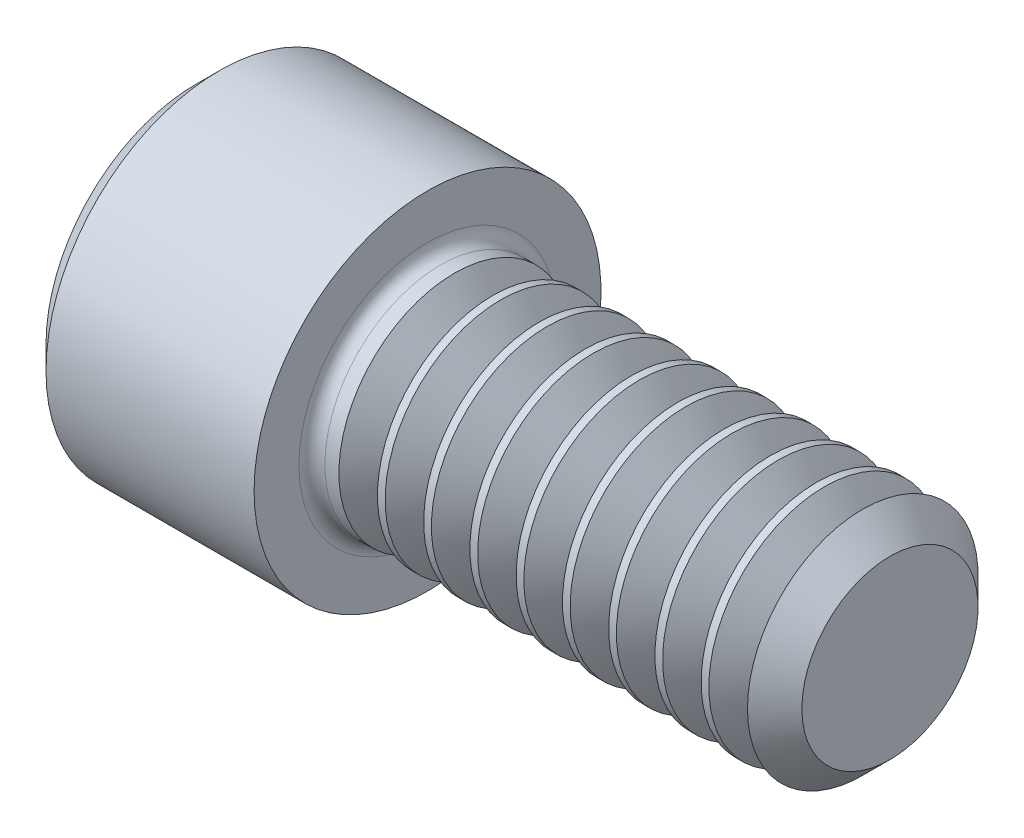
ISO-10303-21;
HEADER;
FILE_DESCRIPTION(('STEP AP214'),'2;1');
FILE_NAME('part.step','',(''),(''),'','','');
FILE_SCHEMA(('AUTOMOTIVE_DESIGN { 1 0 10303 214 1 1 1 1 }'));
ENDSEC;
DATA;
#1=APPLICATION_CONTEXT('core data for automotive mechanical design processes');
#2=APPLICATION_PROTOCOL_DEFINITION('international standard','automotive_design',2000,#1);
#3=PRODUCT_CONTEXT('',#1,'mechanical');
#4=PRODUCT('Part','Part','',(#3));
#5=PRODUCT_RELATED_PRODUCT_CATEGORY('part','',(#4));
#6=PRODUCT_DEFINITION_FORMATION('','',#4);
#7=PRODUCT_DEFINITION_CONTEXT('part definition',#1,'design');
#8=PRODUCT_DEFINITION('design','',#6,#7);
#9=PRODUCT_DEFINITION_SHAPE('','',#8);
#10=(LENGTH_UNIT() NAMED_UNIT(*) SI_UNIT(.MILLI.,.METRE.));
#11=(NAMED_UNIT(*) PLANE_ANGLE_UNIT() SI_UNIT($,.RADIAN.));
#12=(NAMED_UNIT(*) SI_UNIT($,.STERADIAN.) SOLID_ANGLE_UNIT());
#13=UNCERTAINTY_MEASURE_WITH_UNIT(LENGTH_MEASURE(1.E-05),#10,'distance_accuracy_value','');
#14=(GEOMETRIC_REPRESENTATION_CONTEXT(3) GLOBAL_UNCERTAINTY_ASSIGNED_CONTEXT((#13)) GLOBAL_UNIT_ASSIGNED_CONTEXT((#10,
#11,#12)) REPRESENTATION_CONTEXT('',''));
#15=CARTESIAN_POINT('',(0.,0.,0.));
#16=DIRECTION('',(0.,0.,1.));
#17=DIRECTION('',(1.,0.,0.));
#18=AXIS2_PLACEMENT_3D('',#15,#16,#17);
#19=CARTESIAN_POINT('',(0.,0.,0.));
#20=DIRECTION('',(-1.,0.,0.));
#21=DIRECTION('',(0.,0.,1.));
#22=AXIS2_PLACEMENT_3D('',#19,#20,#21);
#23=PLANE('',#22);
#24=DIRECTION('',(0.,-0.499999999999998,0.86602540378444));
#25=VECTOR('',#24,1.);
#26=CARTESIAN_POINT('',(0.,2.7496306570156,0.));
#27=LINE('',#26,#25);
#28=CARTESIAN_POINT('',(0.,2.7496306570156,0.));
#29=VERTEX_POINT('',#28);
#30=CARTESIAN_POINT('',(0.,1.37481532850781,2.38125));
#31=VERTEX_POINT('',#30);
#32=EDGE_CURVE('E685',#29,#31,#27,.T.);
#33=ORIENTED_EDGE('',*,*,#32,.T.);
#34=DIRECTION('',(0.,1.,0.));
#35=VECTOR('',#34,1.);
#36=CARTESIAN_POINT('',(0.,-1.37481532850779,2.38125));
#37=LINE('',#36,#35);
#38=CARTESIAN_POINT('',(0.,-1.37481532850779,2.38125));
#39=VERTEX_POINT('',#38);
#40=EDGE_CURVE('E130',#39,#31,#37,.T.);
#41=ORIENTED_EDGE('',*,*,#40,.F.);
#42=DIRECTION('',(0.,-0.500000000000001,-0.866025403784438));
#43=VECTOR('',#42,1.);
#44=CARTESIAN_POINT('',(0.,-1.37481532850779,2.38125));
#45=LINE('',#44,#43);
#46=CARTESIAN_POINT('',(0.,-2.74963065701559,0.));
#47=VERTEX_POINT('',#46);
#48=EDGE_CURVE('E704',#39,#47,#45,.T.);
#49=ORIENTED_EDGE('',*,*,#48,.T.);
#50=DIRECTION('',(0.,0.499999999999998,-0.86602540378444));
#51=VECTOR('',#50,1.);
#52=CARTESIAN_POINT('',(0.,-2.74963065701559,0.));
#53=LINE('',#52,#51);
#54=CARTESIAN_POINT('',(0.,-1.37481532850779,-2.38125));
#55=VERTEX_POINT('',#54);
#56=EDGE_CURVE('E707',#47,#55,#53,.T.);
#57=ORIENTED_EDGE('',*,*,#56,.T.);
#58=DIRECTION('',(0.,-1.,0.));
#59=VECTOR('',#58,1.);
#60=CARTESIAN_POINT('',(0.,1.3748153285078,-2.38125));
#61=LINE('',#60,#59);
#62=CARTESIAN_POINT('',(0.,1.3748153285078,-2.38125));
#63=VERTEX_POINT('',#62);
#64=EDGE_CURVE('E710',#63,#55,#61,.T.);
#65=ORIENTED_EDGE('',*,*,#64,.F.);
#66=DIRECTION('',(0.,-0.500000000000001,-0.866025403784438));
#67=VECTOR('',#66,1.);
#68=CARTESIAN_POINT('',(0.,2.7496306570156,0.));
#69=LINE('',#68,#67);
#70=EDGE_CURVE('E125',#29,#63,#69,.T.);
#71=ORIENTED_EDGE('',*,*,#70,.F.);
#72=EDGE_LOOP('',(#33,#41,#49,#57,#65,#71));
#73=FACE_BOUND('',#72,.T.);
#74=CARTESIAN_POINT('',(0.,0.,0.));
#75=DIRECTION('',(-1.,0.,0.));
#76=DIRECTION('',(0.,0.,1.));
#77=AXIS2_PLACEMENT_3D('',#74,#75,#76);
#78=CIRCLE('',#77,4.1275);
#79=CARTESIAN_POINT('',(0.,0.,4.1275));
#80=VERTEX_POINT('',#79);
#81=EDGE_CURVE('E141',#80,#80,#78,.T.);
#82=ORIENTED_EDGE('',*,*,#81,.T.);
#83=EDGE_LOOP('',(#82));
#84=FACE_BOUND('',#83,.T.);
#85=ADVANCED_FACE('F33',(#73,#84),#23,.T.);
#86=CARTESIAN_POINT('',(-31.75,0.,0.));
#87=DIRECTION('',(-1.,0.,0.));
#88=DIRECTION('',(0.,0.,1.));
#89=AXIS2_PLACEMENT_3D('',#86,#87,#88);
#90=CYLINDRICAL_SURFACE('',#89,3.17499999999998);
#91=CARTESIAN_POINT('',(7.09088817375183,0.,0.));
#92=DIRECTION('',(-1.,0.,0.));
#93=DIRECTION('',(0.,-1.,0.));
#94=AXIS2_PLACEMENT_3D('',#91,#92,#93);
#95=CIRCLE('',#94,3.175);
#96=CARTESIAN_POINT('',(7.09088817375183,-3.175,0.));
#97=VERTEX_POINT('',#96);
#98=EDGE_CURVE('E680',#97,#97,#95,.T.);
#99=ORIENTED_EDGE('',*,*,#98,.T.);
#100=EDGE_LOOP('',(#99));
#101=FACE_BOUND('',#100,.T.);
#102=CARTESIAN_POINT('',(6.7056,0.,0.));
#103=DIRECTION('',(1.,0.,0.));
#104=DIRECTION('',(0.,0.,-1.));
#105=AXIS2_PLACEMENT_3D('',#102,#103,#104);
#106=CIRCLE('',#105,3.17499999999998);
#107=CARTESIAN_POINT('',(6.7056,0.,-3.17499999999998));
#108=VERTEX_POINT('',#107);
#109=EDGE_CURVE('E11',#108,#108,#106,.T.);
#110=ORIENTED_EDGE('',*,*,#109,.T.);
#111=EDGE_LOOP('',(#110));
#112=FACE_BOUND('',#111,.T.);
#113=ADVANCED_FACE('F173',(#101,#112),#90,.T.);
#114=CARTESIAN_POINT('',(6.35,4.7625,0.));
#115=DIRECTION('',(1.,0.,0.));
#116=DIRECTION('',(0.,0.,-1.));
#117=AXIS2_PLACEMENT_3D('',#114,#115,#116);
#118=PLANE('',#117);
#119=CARTESIAN_POINT('',(6.35,0.,0.));
#120=DIRECTION('',(1.,0.,0.));
#121=DIRECTION('',(0.,0.,-1.));
#122=AXIS2_PLACEMENT_3D('',#119,#120,#121);
#123=CIRCLE('',#122,3.53059999999998);
#124=CARTESIAN_POINT('',(6.35,0.,-3.53059999999998));
#125=VERTEX_POINT('',#124);
#126=EDGE_CURVE('E42',#125,#125,#123,.F.);
#127=ORIENTED_EDGE('',*,*,#126,.T.);
#128=EDGE_LOOP('',(#127));
#129=FACE_BOUND('',#128,.T.);
#130=CARTESIAN_POINT('',(6.35,0.,0.));
#131=DIRECTION('',(-1.,0.,0.));
#132=DIRECTION('',(0.,0.,1.));
#133=AXIS2_PLACEMENT_3D('',#130,#131,#132);
#134=CIRCLE('',#133,4.7625);
#135=CARTESIAN_POINT('',(6.35,0.,4.7625));
#136=VERTEX_POINT('',#135);
#137=EDGE_CURVE('E148',#136,#136,#134,.T.);
#138=ORIENTED_EDGE('',*,*,#137,.F.);
#139=EDGE_LOOP('',(#138));
#140=FACE_BOUND('',#139,.T.);
#141=ADVANCED_FACE('F157',(#129,#140),#118,.T.);
#142=CARTESIAN_POINT('',(-31.75,0.,0.));
#143=DIRECTION('',(-1.,0.,0.));
#144=DIRECTION('',(0.,0.,1.));
#145=AXIS2_PLACEMENT_3D('',#142,#143,#144);
#146=CYLINDRICAL_SURFACE('',#145,4.7625);
#147=ORIENTED_EDGE('',*,*,#137,.T.);
#148=EDGE_LOOP('',(#147));
#149=FACE_BOUND('',#148,.T.);
#150=CARTESIAN_POINT('',(0.635000000000004,0.,0.));
#151=DIRECTION('',(-1.,0.,0.));
#152=DIRECTION('',(0.,0.,1.));
#153=AXIS2_PLACEMENT_3D('',#150,#151,#152);
#154=CIRCLE('',#153,4.7625);
#155=CARTESIAN_POINT('',(0.635000000000004,0.,4.7625));
#156=VERTEX_POINT('',#155);
#157=EDGE_CURVE('E145',#156,#156,#154,.T.);
#158=ORIENTED_EDGE('',*,*,#157,.F.);
#159=EDGE_LOOP('',(#158));
#160=FACE_BOUND('',#159,.T.);
#161=ADVANCED_FACE('F168',(#149,#160),#146,.T.);
#162=CARTESIAN_POINT('',(0.,0.,0.));
#163=DIRECTION('',(1.,0.,0.));
#164=DIRECTION('',(0.,0.,-1.));
#165=AXIS2_PLACEMENT_3D('',#162,#163,#164);
#166=CONICAL_SURFACE('',#165,4.1275,0.785398163397444);
#167=ORIENTED_EDGE('',*,*,#157,.T.);
#168=EDGE_LOOP('',(#167));
#169=FACE_BOUND('',#168,.T.);
#170=ORIENTED_EDGE('',*,*,#81,.F.);
#171=EDGE_LOOP('',(#170));
#172=FACE_BOUND('',#171,.T.);
#173=ADVANCED_FACE('F161',(#169,#172),#166,.T.);
#174=CARTESIAN_POINT('',(6.7056,0.,0.));
#175=DIRECTION('',(1.,0.,0.));
#176=DIRECTION('',(0.,0.,-1.));
#177=AXIS2_PLACEMENT_3D('',#174,#175,#176);
#178=TOROIDAL_SURFACE('',#177,3.53059999999998,0.3556);
#179=ORIENTED_EDGE('',*,*,#109,.F.);
#180=EDGE_LOOP('',(#179));
#181=FACE_BOUND('',#180,.T.);
#182=ORIENTED_EDGE('',*,*,#126,.F.);
#183=EDGE_LOOP('',(#182));
#184=FACE_BOUND('',#183,.T.);
#185=ADVANCED_FACE('F35',(#181,#184),#178,.F.);
#186=CARTESIAN_POINT('',(3.048,2.7496306570156,0.));
#187=DIRECTION('',(0.,-0.86602540378444,-0.499999999999998));
#188=DIRECTION('',(0.,0.499999999999998,-0.86602540378444));
#189=AXIS2_PLACEMENT_3D('',#186,#187,#188);
#190=PLANE('',#189);
#191=ORIENTED_EDGE('',*,*,#32,.F.);
#192=DIRECTION('',(-1.,0.,0.));
#193=VECTOR('',#192,1.);
#194=CARTESIAN_POINT('',(3.048,2.7496306570156,0.));
#195=LINE('',#194,#193);
#196=CARTESIAN_POINT('',(3.048,2.7496306570156,0.));
#197=VERTEX_POINT('',#196);
#198=EDGE_CURVE('E701',#197,#29,#195,.T.);
#199=ORIENTED_EDGE('',*,*,#198,.F.);
#200=DIRECTION('',(0.,-0.499999999999998,0.86602540378444));
#201=VECTOR('',#200,1.);
#202=CARTESIAN_POINT('',(3.048,2.7496306570156,0.));
#203=LINE('',#202,#201);
#204=CARTESIAN_POINT('',(3.048,2.0622229927617,1.190625));
#205=VERTEX_POINT('',#204);
#206=EDGE_CURVE('E117',#197,#205,#203,.T.);
#207=ORIENTED_EDGE('',*,*,#206,.T.);
#208=CARTESIAN_POINT('',(3.048,1.37481532850781,2.38125));
#209=VERTEX_POINT('',#208);
#210=EDGE_CURVE('E108',#205,#209,#203,.T.);
#211=ORIENTED_EDGE('',*,*,#210,.T.);
#212=DIRECTION('',(-1.,0.,0.));
#213=VECTOR('',#212,1.);
#214=CARTESIAN_POINT('',(3.048,1.37481532850781,2.38125));
#215=LINE('',#214,#213);
#216=EDGE_CURVE('E122',#209,#31,#215,.T.);
#217=ORIENTED_EDGE('',*,*,#216,.T.);
#218=EDGE_LOOP('',(#191,#199,#207,#211,#217));
#219=FACE_BOUND('',#218,.T.);
#220=ADVANCED_FACE('F121',(#219),#190,.T.);
#221=CARTESIAN_POINT('',(3.048,-1.37481532850779,2.38125));
#222=DIRECTION('',(0.,0.,1.));
#223=DIRECTION('',(0.,-1.,0.));
#224=AXIS2_PLACEMENT_3D('',#221,#222,#223);
#225=PLANE('',#224);
#226=ORIENTED_EDGE('',*,*,#40,.T.);
#227=ORIENTED_EDGE('',*,*,#216,.F.);
#228=DIRECTION('',(0.,1.,0.));
#229=VECTOR('',#228,1.);
#230=CARTESIAN_POINT('',(3.048,-1.37481532850779,2.38125));
#231=LINE('',#230,#229);
#232=CARTESIAN_POINT('',(3.048,0.,2.38125));
#233=VERTEX_POINT('',#232);
#234=EDGE_CURVE('E105',#233,#209,#231,.T.);
#235=ORIENTED_EDGE('',*,*,#234,.F.);
#236=CARTESIAN_POINT('',(3.048,-1.37481532850779,2.38125));
#237=VERTEX_POINT('',#236);
#238=EDGE_CURVE('E116',#237,#233,#231,.T.);
#239=ORIENTED_EDGE('',*,*,#238,.F.);
#240=DIRECTION('',(-1.,0.,0.));
#241=VECTOR('',#240,1.);
#242=CARTESIAN_POINT('',(3.048,-1.37481532850779,2.38125));
#243=LINE('',#242,#241);
#244=EDGE_CURVE('E132',#237,#39,#243,.T.);
#245=ORIENTED_EDGE('',*,*,#244,.T.);
#246=EDGE_LOOP('',(#226,#227,#235,#239,#245));
#247=FACE_BOUND('',#246,.T.);
#248=ADVANCED_FACE('F127',(#247),#225,.F.);
#249=CARTESIAN_POINT('',(3.048,-1.37481532850779,2.38125));
#250=DIRECTION('',(0.,0.866025403784438,-0.500000000000001));
#251=DIRECTION('',(0.,0.500000000000001,0.866025403784438));
#252=AXIS2_PLACEMENT_3D('',#249,#250,#251);
#253=PLANE('',#252);
#254=ORIENTED_EDGE('',*,*,#48,.F.);
#255=ORIENTED_EDGE('',*,*,#244,.F.);
#256=DIRECTION('',(0.,-0.500000000000001,-0.866025403784438));
#257=VECTOR('',#256,1.);
#258=CARTESIAN_POINT('',(3.048,-1.37481532850779,2.38125));
#259=LINE('',#258,#257);
#260=CARTESIAN_POINT('',(3.048,-2.06222299276169,1.190625));
#261=VERTEX_POINT('',#260);
#262=EDGE_CURVE('E688',#237,#261,#259,.T.);
#263=ORIENTED_EDGE('',*,*,#262,.T.);
#264=CARTESIAN_POINT('',(3.048,-2.74963065701559,0.));
#265=VERTEX_POINT('',#264);
#266=EDGE_CURVE('E687',#261,#265,#259,.T.);
#267=ORIENTED_EDGE('',*,*,#266,.T.);
#268=DIRECTION('',(-1.,0.,0.));
#269=VECTOR('',#268,1.);
#270=CARTESIAN_POINT('',(3.048,-2.74963065701559,0.));
#271=LINE('',#270,#269);
#272=EDGE_CURVE('E137',#265,#47,#271,.T.);
#273=ORIENTED_EDGE('',*,*,#272,.T.);
#274=EDGE_LOOP('',(#254,#255,#263,#267,#273));
#275=FACE_BOUND('',#274,.T.);
#276=ADVANCED_FACE('F302',(#275),#253,.T.);
#277=CARTESIAN_POINT('',(3.048,-2.74963065701559,0.));
#278=DIRECTION('',(0.,0.86602540378444,0.499999999999998));
#279=DIRECTION('',(0.,-0.499999999999998,0.86602540378444));
#280=AXIS2_PLACEMENT_3D('',#277,#278,#279);
#281=PLANE('',#280);
#282=ORIENTED_EDGE('',*,*,#56,.F.);
#283=ORIENTED_EDGE('',*,*,#272,.F.);
#284=DIRECTION('',(0.,0.499999999999998,-0.86602540378444));
#285=VECTOR('',#284,1.);
#286=CARTESIAN_POINT('',(3.048,-2.74963065701559,0.));
#287=LINE('',#286,#285);
#288=CARTESIAN_POINT('',(3.048,-2.06222299276169,-1.19062499999999));
#289=VERTEX_POINT('',#288);
#290=EDGE_CURVE('E692',#265,#289,#287,.T.);
#291=ORIENTED_EDGE('',*,*,#290,.T.);
#292=CARTESIAN_POINT('',(3.048,-1.37481532850779,-2.38125));
#293=VERTEX_POINT('',#292);
#294=EDGE_CURVE('E691',#289,#293,#287,.T.);
#295=ORIENTED_EDGE('',*,*,#294,.T.);
#296=DIRECTION('',(-1.,0.,0.));
#297=VECTOR('',#296,1.);
#298=CARTESIAN_POINT('',(3.048,-1.37481532850779,-2.38125));
#299=LINE('',#298,#297);
#300=EDGE_CURVE('E719',#293,#55,#299,.T.);
#301=ORIENTED_EDGE('',*,*,#300,.T.);
#302=EDGE_LOOP('',(#282,#283,#291,#295,#301));
#303=FACE_BOUND('',#302,.T.);
#304=ADVANCED_FACE('F298',(#303),#281,.T.);
#305=CARTESIAN_POINT('',(3.048,1.3748153285078,-2.38125));
#306=DIRECTION('',(0.,0.,-1.));
#307=DIRECTION('',(0.,1.,0.));
#308=AXIS2_PLACEMENT_3D('',#305,#306,#307);
#309=PLANE('',#308);
#310=ORIENTED_EDGE('',*,*,#64,.T.);
#311=ORIENTED_EDGE('',*,*,#300,.F.);
#312=DIRECTION('',(0.,-1.,0.));
#313=VECTOR('',#312,1.);
#314=CARTESIAN_POINT('',(3.048,1.3748153285078,-2.38125));
#315=LINE('',#314,#313);
#316=CARTESIAN_POINT('',(3.048,0.,-2.38125));
#317=VERTEX_POINT('',#316);
#318=EDGE_CURVE('E695',#317,#293,#315,.T.);
#319=ORIENTED_EDGE('',*,*,#318,.F.);
#320=CARTESIAN_POINT('',(3.048,1.3748153285078,-2.38125));
#321=VERTEX_POINT('',#320);
#322=EDGE_CURVE('E49',#321,#317,#315,.T.);
#323=ORIENTED_EDGE('',*,*,#322,.F.);
#324=DIRECTION('',(-1.,0.,0.));
#325=VECTOR('',#324,1.);
#326=CARTESIAN_POINT('',(3.048,1.3748153285078,-2.38125));
#327=LINE('',#326,#325);
#328=EDGE_CURVE('E716',#321,#63,#327,.T.);
#329=ORIENTED_EDGE('',*,*,#328,.T.);
#330=EDGE_LOOP('',(#310,#311,#319,#323,#329));
#331=FACE_BOUND('',#330,.T.);
#332=ADVANCED_FACE('F294',(#331),#309,.F.);
#333=CARTESIAN_POINT('',(3.048,2.7496306570156,0.));
#334=DIRECTION('',(0.,0.866025403784438,-0.500000000000001));
#335=DIRECTION('',(0.,0.500000000000001,0.866025403784438));
#336=AXIS2_PLACEMENT_3D('',#333,#334,#335);
#337=PLANE('',#336);
#338=ORIENTED_EDGE('',*,*,#70,.T.);
#339=ORIENTED_EDGE('',*,*,#328,.F.);
#340=DIRECTION('',(0.,-0.500000000000001,-0.866025403784438));
#341=VECTOR('',#340,1.);
#342=CARTESIAN_POINT('',(3.048,2.7496306570156,0.));
#343=LINE('',#342,#341);
#344=CARTESIAN_POINT('',(3.048,2.0622229927617,-1.190625));
#345=VERTEX_POINT('',#344);
#346=EDGE_CURVE('E697',#345,#321,#343,.T.);
#347=ORIENTED_EDGE('',*,*,#346,.F.);
#348=EDGE_CURVE('E698',#197,#345,#343,.T.);
#349=ORIENTED_EDGE('',*,*,#348,.F.);
#350=ORIENTED_EDGE('',*,*,#198,.T.);
#351=EDGE_LOOP('',(#338,#339,#347,#349,#350));
#352=FACE_BOUND('',#351,.T.);
#353=ADVANCED_FACE('F289',(#352),#337,.F.);
#354=CARTESIAN_POINT('',(3.048,4.12444598552339,-2.38125000000001));
#355=DIRECTION('',(1.,0.,0.));
#356=DIRECTION('',(0.,0.,-1.));
#357=AXIS2_PLACEMENT_3D('',#354,#355,#356);
#358=PLANE('',#357);
#359=ORIENTED_EDGE('',*,*,#318,.T.);
#360=ORIENTED_EDGE('',*,*,#294,.F.);
#361=CARTESIAN_POINT('',(3.048,0.,0.));
#362=DIRECTION('',(-1.,0.,0.));
#363=DIRECTION('',(0.,0.,1.));
#364=AXIS2_PLACEMENT_3D('',#361,#362,#363);
#365=CIRCLE('',#364,2.38125);
#366=EDGE_CURVE('E734',#317,#289,#365,.T.);
#367=ORIENTED_EDGE('',*,*,#366,.F.);
#368=EDGE_LOOP('',(#359,#360,#367));
#369=FACE_BOUND('',#368,.T.);
#370=ADVANCED_FACE('F285',(#369),#358,.F.);
#371=ORIENTED_EDGE('',*,*,#290,.F.);
#372=ORIENTED_EDGE('',*,*,#266,.F.);
#373=EDGE_CURVE('E135',#289,#261,#365,.T.);
#374=ORIENTED_EDGE('',*,*,#373,.F.);
#375=EDGE_LOOP('',(#371,#372,#374));
#376=FACE_BOUND('',#375,.T.);
#377=ADVANCED_FACE('F288',(#376),#358,.F.);
#378=ORIENTED_EDGE('',*,*,#262,.F.);
#379=ORIENTED_EDGE('',*,*,#238,.T.);
#380=EDGE_CURVE('E131',#261,#233,#365,.T.);
#381=ORIENTED_EDGE('',*,*,#380,.F.);
#382=EDGE_LOOP('',(#378,#379,#381));
#383=FACE_BOUND('',#382,.T.);
#384=ADVANCED_FACE('F338',(#383),#358,.F.);
#385=ORIENTED_EDGE('',*,*,#234,.T.);
#386=ORIENTED_EDGE('',*,*,#210,.F.);
#387=EDGE_CURVE('E111',#233,#205,#365,.T.);
#388=ORIENTED_EDGE('',*,*,#387,.F.);
#389=EDGE_LOOP('',(#385,#386,#388));
#390=FACE_BOUND('',#389,.T.);
#391=ADVANCED_FACE('F107',(#390),#358,.F.);
#392=ORIENTED_EDGE('',*,*,#206,.F.);
#393=ORIENTED_EDGE('',*,*,#348,.T.);
#394=EDGE_CURVE('E142',#205,#345,#365,.T.);
#395=ORIENTED_EDGE('',*,*,#394,.F.);
#396=EDGE_LOOP('',(#392,#393,#395));
#397=FACE_BOUND('',#396,.T.);
#398=ADVANCED_FACE('F351',(#397),#358,.F.);
#399=ORIENTED_EDGE('',*,*,#346,.T.);
#400=ORIENTED_EDGE('',*,*,#322,.T.);
#401=EDGE_CURVE('E733',#345,#317,#365,.T.);
#402=ORIENTED_EDGE('',*,*,#401,.F.);
#403=EDGE_LOOP('',(#399,#400,#402));
#404=FACE_BOUND('',#403,.T.);
#405=ADVANCED_FACE('F291',(#404),#358,.F.);
#406=CARTESIAN_POINT('',(3.048,0.,0.));
#407=DIRECTION('',(-1.,0.,0.));
#408=DIRECTION('',(0.,0.,1.));
#409=AXIS2_PLACEMENT_3D('',#406,#407,#408);
#410=CONICAL_SURFACE('',#409,2.38125,1.04719755119659);
#411=CARTESIAN_POINT('',(4.42281532850781,0.,0.));
#412=VERTEX_POINT('',#411);
#413=VERTEX_LOOP('',#412);
#414=FACE_BOUND('',#413,.T.);
#415=ORIENTED_EDGE('',*,*,#387,.T.);
#416=ORIENTED_EDGE('',*,*,#394,.T.);
#417=ORIENTED_EDGE('',*,*,#401,.T.);
#418=ORIENTED_EDGE('',*,*,#366,.T.);
#419=ORIENTED_EDGE('',*,*,#373,.T.);
#420=ORIENTED_EDGE('',*,*,#380,.T.);
#421=EDGE_LOOP('',(#415,#416,#417,#418,#419,#420));
#422=FACE_BOUND('',#421,.T.);
#423=ADVANCED_FACE('F185',(#414,#422),#410,.F.);
#424=CARTESIAN_POINT('',(8.14911182624816,0.,0.));
#425=DIRECTION('',(1.,0.,0.));
#426=DIRECTION('',(0.,1.,0.));
#427=AXIS2_PLACEMENT_3D('',#424,#425,#426);
#428=CONICAL_SURFACE('',#427,3.175,0.959931088596884);
#429=CARTESIAN_POINT('',(7.62,0.,0.));
#430=DIRECTION('',(-1.,0.,0.));
#431=DIRECTION('',(0.,-1.,0.));
#432=AXIS2_PLACEMENT_3D('',#429,#430,#431);
#433=CIRCLE('',#432,2.41935);
#434=CARTESIAN_POINT('',(7.62,-2.41935,0.));
#435=VERTEX_POINT('',#434);
#436=EDGE_CURVE('E677',#435,#435,#433,.T.);
#437=ORIENTED_EDGE('',*,*,#436,.F.);
#438=EDGE_LOOP('',(#437));
#439=FACE_BOUND('',#438,.T.);
#440=CARTESIAN_POINT('',(8.14911182624816,0.,0.));
#441=DIRECTION('',(-1.,0.,0.));
#442=DIRECTION('',(0.,-1.,0.));
#443=AXIS2_PLACEMENT_3D('',#440,#441,#442);
#444=CIRCLE('',#443,3.175);
#445=CARTESIAN_POINT('',(8.14911182624816,-3.175,0.));
#446=VERTEX_POINT('',#445);
#447=EDGE_CURVE('E683',#446,#446,#444,.T.);
#448=ORIENTED_EDGE('',*,*,#447,.T.);
#449=EDGE_LOOP('',(#448));
#450=FACE_BOUND('',#449,.T.);
#451=ADVANCED_FACE('F280',(#439,#450),#428,.T.);
#452=CARTESIAN_POINT('',(7.62,0.,0.));
#453=DIRECTION('',(-1.,0.,0.));
#454=DIRECTION('',(0.,-1.,0.));
#455=AXIS2_PLACEMENT_3D('',#452,#453,#454);
#456=CONICAL_SURFACE('',#455,2.41935,0.959931088596876);
#457=ORIENTED_EDGE('',*,*,#98,.F.);
#458=EDGE_LOOP('',(#457));
#459=FACE_BOUND('',#458,.T.);
#460=ORIENTED_EDGE('',*,*,#436,.T.);
#461=EDGE_LOOP('',(#460));
#462=FACE_BOUND('',#461,.T.);
#463=ADVANCED_FACE('F277',(#459,#462),#456,.T.);
#464=CARTESIAN_POINT('',(8.36088817375183,0.,0.));
#465=DIRECTION('',(-1.,0.,0.));
#466=DIRECTION('',(0.,-1.,0.));
#467=AXIS2_PLACEMENT_3D('',#464,#465,#466);
#468=CIRCLE('',#467,3.175);
#469=CARTESIAN_POINT('',(8.36088817375183,-3.175,0.));
#470=VERTEX_POINT('',#469);
#471=EDGE_CURVE('E671',#470,#470,#468,.T.);
#472=ORIENTED_EDGE('',*,*,#471,.T.);
#473=EDGE_LOOP('',(#472));
#474=FACE_BOUND('',#473,.T.);
#475=ORIENTED_EDGE('',*,*,#447,.F.);
#476=EDGE_LOOP('',(#475));
#477=FACE_BOUND('',#476,.T.);
#478=ADVANCED_FACE('F182',(#474,#477),#90,.T.);
#479=CARTESIAN_POINT('',(9.41911182624816,0.,0.));
#480=DIRECTION('',(1.,0.,0.));
#481=DIRECTION('',(0.,1.,0.));
#482=AXIS2_PLACEMENT_3D('',#479,#480,#481);
#483=CONICAL_SURFACE('',#482,3.175,0.959931088596884);
#484=CARTESIAN_POINT('',(8.89,0.,0.));
#485=DIRECTION('',(-1.,0.,0.));
#486=DIRECTION('',(0.,-1.,0.));
#487=AXIS2_PLACEMENT_3D('',#484,#485,#486);
#488=CIRCLE('',#487,2.41935);
#489=CARTESIAN_POINT('',(8.89,-2.41935,0.));
#490=VERTEX_POINT('',#489);
#491=EDGE_CURVE('E668',#490,#490,#488,.T.);
#492=ORIENTED_EDGE('',*,*,#491,.F.);
#493=EDGE_LOOP('',(#492));
#494=FACE_BOUND('',#493,.T.);
#495=CARTESIAN_POINT('',(9.41911182624816,0.,0.));
#496=DIRECTION('',(-1.,0.,0.));
#497=DIRECTION('',(0.,-1.,0.));
#498=AXIS2_PLACEMENT_3D('',#495,#496,#497);
#499=CIRCLE('',#498,3.175);
#500=CARTESIAN_POINT('',(9.41911182624816,-3.175,0.));
#501=VERTEX_POINT('',#500);
#502=EDGE_CURVE('E674',#501,#501,#499,.T.);
#503=ORIENTED_EDGE('',*,*,#502,.T.);
#504=EDGE_LOOP('',(#503));
#505=FACE_BOUND('',#504,.T.);
#506=ADVANCED_FACE('F272',(#494,#505),#483,.T.);
#507=CARTESIAN_POINT('',(8.89,0.,0.));
#508=DIRECTION('',(-1.,0.,0.));
#509=DIRECTION('',(0.,-1.,0.));
#510=AXIS2_PLACEMENT_3D('',#507,#508,#509);
#511=CONICAL_SURFACE('',#510,2.41935,0.959931088596876);
#512=ORIENTED_EDGE('',*,*,#471,.F.);
#513=EDGE_LOOP('',(#512));
#514=FACE_BOUND('',#513,.T.);
#515=ORIENTED_EDGE('',*,*,#491,.T.);
#516=EDGE_LOOP('',(#515));
#517=FACE_BOUND('',#516,.T.);
#518=ADVANCED_FACE('F269',(#514,#517),#511,.T.);
#519=CARTESIAN_POINT('',(9.63088817375183,0.,0.));
#520=DIRECTION('',(-1.,0.,0.));
#521=DIRECTION('',(0.,-1.,0.));
#522=AXIS2_PLACEMENT_3D('',#519,#520,#521);
#523=CIRCLE('',#522,3.175);
#524=CARTESIAN_POINT('',(9.63088817375183,-3.175,0.));
#525=VERTEX_POINT('',#524);
#526=EDGE_CURVE('E662',#525,#525,#523,.T.);
#527=ORIENTED_EDGE('',*,*,#526,.T.);
#528=EDGE_LOOP('',(#527));
#529=FACE_BOUND('',#528,.T.);
#530=ORIENTED_EDGE('',*,*,#502,.F.);
#531=EDGE_LOOP('',(#530));
#532=FACE_BOUND('',#531,.T.);
#533=ADVANCED_FACE('F267',(#529,#532),#90,.T.);
#534=CARTESIAN_POINT('',(10.6891118262482,0.,0.));
#535=DIRECTION('',(1.,0.,0.));
#536=DIRECTION('',(0.,1.,0.));
#537=AXIS2_PLACEMENT_3D('',#534,#535,#536);
#538=CONICAL_SURFACE('',#537,3.175,0.959931088596884);
#539=CARTESIAN_POINT('',(10.16,0.,0.));
#540=DIRECTION('',(-1.,0.,0.));
#541=DIRECTION('',(0.,-1.,0.));
#542=AXIS2_PLACEMENT_3D('',#539,#540,#541);
#543=CIRCLE('',#542,2.41935);
#544=CARTESIAN_POINT('',(10.16,-2.41935,0.));
#545=VERTEX_POINT('',#544);
#546=EDGE_CURVE('E659',#545,#545,#543,.T.);
#547=ORIENTED_EDGE('',*,*,#546,.F.);
#548=EDGE_LOOP('',(#547));
#549=FACE_BOUND('',#548,.T.);
#550=CARTESIAN_POINT('',(10.6891118262482,0.,0.));
#551=DIRECTION('',(-1.,0.,0.));
#552=DIRECTION('',(0.,-1.,0.));
#553=AXIS2_PLACEMENT_3D('',#550,#551,#552);
#554=CIRCLE('',#553,3.175);
#555=CARTESIAN_POINT('',(10.6891118262482,-3.175,0.));
#556=VERTEX_POINT('',#555);
#557=EDGE_CURVE('E665',#556,#556,#554,.T.);
#558=ORIENTED_EDGE('',*,*,#557,.T.);
#559=EDGE_LOOP('',(#558));
#560=FACE_BOUND('',#559,.T.);
#561=ADVANCED_FACE('F263',(#549,#560),#538,.T.);
#562=CARTESIAN_POINT('',(10.16,0.,0.));
#563=DIRECTION('',(-1.,0.,0.));
#564=DIRECTION('',(0.,-1.,0.));
#565=AXIS2_PLACEMENT_3D('',#562,#563,#564);
#566=CONICAL_SURFACE('',#565,2.41935,0.959931088596876);
#567=ORIENTED_EDGE('',*,*,#526,.F.);
#568=EDGE_LOOP('',(#567));
#569=FACE_BOUND('',#568,.T.);
#570=ORIENTED_EDGE('',*,*,#546,.T.);
#571=EDGE_LOOP('',(#570));
#572=FACE_BOUND('',#571,.T.);
#573=ADVANCED_FACE('F260',(#569,#572),#566,.T.);
#574=CARTESIAN_POINT('',(10.9008881737518,0.,0.));
#575=DIRECTION('',(-1.,0.,0.));
#576=DIRECTION('',(0.,-1.,0.));
#577=AXIS2_PLACEMENT_3D('',#574,#575,#576);
#578=CIRCLE('',#577,3.175);
#579=CARTESIAN_POINT('',(10.9008881737518,-3.175,0.));
#580=VERTEX_POINT('',#579);
#581=EDGE_CURVE('E653',#580,#580,#578,.T.);
#582=ORIENTED_EDGE('',*,*,#581,.T.);
#583=EDGE_LOOP('',(#582));
#584=FACE_BOUND('',#583,.T.);
#585=ORIENTED_EDGE('',*,*,#557,.F.);
#586=EDGE_LOOP('',(#585));
#587=FACE_BOUND('',#586,.T.);
#588=ADVANCED_FACE('F258',(#584,#587),#90,.T.);
#589=CARTESIAN_POINT('',(11.9591118262482,0.,0.));
#590=DIRECTION('',(1.,0.,0.));
#591=DIRECTION('',(0.,1.,0.));
#592=AXIS2_PLACEMENT_3D('',#589,#590,#591);
#593=CONICAL_SURFACE('',#592,3.175,0.959931088596884);
#594=CARTESIAN_POINT('',(11.43,0.,0.));
#595=DIRECTION('',(-1.,0.,0.));
#596=DIRECTION('',(0.,-1.,0.));
#597=AXIS2_PLACEMENT_3D('',#594,#595,#596);
#598=CIRCLE('',#597,2.41935);
#599=CARTESIAN_POINT('',(11.43,-2.41935,0.));
#600=VERTEX_POINT('',#599);
#601=EDGE_CURVE('E650',#600,#600,#598,.T.);
#602=ORIENTED_EDGE('',*,*,#601,.F.);
#603=EDGE_LOOP('',(#602));
#604=FACE_BOUND('',#603,.T.);
#605=CARTESIAN_POINT('',(11.9591118262482,0.,0.));
#606=DIRECTION('',(-1.,0.,0.));
#607=DIRECTION('',(0.,-1.,0.));
#608=AXIS2_PLACEMENT_3D('',#605,#606,#607);
#609=CIRCLE('',#608,3.175);
#610=CARTESIAN_POINT('',(11.9591118262482,-3.175,0.));
#611=VERTEX_POINT('',#610);
#612=EDGE_CURVE('E656',#611,#611,#609,.T.);
#613=ORIENTED_EDGE('',*,*,#612,.T.);
#614=EDGE_LOOP('',(#613));
#615=FACE_BOUND('',#614,.T.);
#616=ADVANCED_FACE('F254',(#604,#615),#593,.T.);
#617=CARTESIAN_POINT('',(11.43,0.,0.));
#618=DIRECTION('',(-1.,0.,0.));
#619=DIRECTION('',(0.,-1.,0.));
#620=AXIS2_PLACEMENT_3D('',#617,#618,#619);
#621=CONICAL_SURFACE('',#620,2.41935,0.959931088596876);
#622=ORIENTED_EDGE('',*,*,#581,.F.);
#623=EDGE_LOOP('',(#622));
#624=FACE_BOUND('',#623,.T.);
#625=ORIENTED_EDGE('',*,*,#601,.T.);
#626=EDGE_LOOP('',(#625));
#627=FACE_BOUND('',#626,.T.);
#628=ADVANCED_FACE('F251',(#624,#627),#621,.T.);
#629=CARTESIAN_POINT('',(12.1708881737518,0.,0.));
#630=DIRECTION('',(-1.,0.,0.));
#631=DIRECTION('',(0.,-1.,0.));
#632=AXIS2_PLACEMENT_3D('',#629,#630,#631);
#633=CIRCLE('',#632,3.175);
#634=CARTESIAN_POINT('',(12.1708881737518,-3.175,0.));
#635=VERTEX_POINT('',#634);
#636=EDGE_CURVE('E644',#635,#635,#633,.T.);
#637=ORIENTED_EDGE('',*,*,#636,.T.);
#638=EDGE_LOOP('',(#637));
#639=FACE_BOUND('',#638,.T.);
#640=ORIENTED_EDGE('',*,*,#612,.F.);
#641=EDGE_LOOP('',(#640));
#642=FACE_BOUND('',#641,.T.);
#643=ADVANCED_FACE('F249',(#639,#642),#90,.T.);
#644=CARTESIAN_POINT('',(13.2291118262482,0.,0.));
#645=DIRECTION('',(1.,0.,0.));
#646=DIRECTION('',(0.,1.,0.));
#647=AXIS2_PLACEMENT_3D('',#644,#645,#646);
#648=CONICAL_SURFACE('',#647,3.175,0.959931088596884);
#649=CARTESIAN_POINT('',(12.7,0.,0.));
#650=DIRECTION('',(-1.,0.,0.));
#651=DIRECTION('',(0.,-1.,0.));
#652=AXIS2_PLACEMENT_3D('',#649,#650,#651);
#653=CIRCLE('',#652,2.41935);
#654=CARTESIAN_POINT('',(12.7,-2.41935,0.));
#655=VERTEX_POINT('',#654);
#656=EDGE_CURVE('E641',#655,#655,#653,.T.);
#657=ORIENTED_EDGE('',*,*,#656,.F.);
#658=EDGE_LOOP('',(#657));
#659=FACE_BOUND('',#658,.T.);
#660=CARTESIAN_POINT('',(13.2291118262482,0.,0.));
#661=DIRECTION('',(-1.,0.,0.));
#662=DIRECTION('',(0.,-1.,0.));
#663=AXIS2_PLACEMENT_3D('',#660,#661,#662);
#664=CIRCLE('',#663,3.175);
#665=CARTESIAN_POINT('',(13.2291118262482,-3.175,0.));
#666=VERTEX_POINT('',#665);
#667=EDGE_CURVE('E647',#666,#666,#664,.T.);
#668=ORIENTED_EDGE('',*,*,#667,.T.);
#669=EDGE_LOOP('',(#668));
#670=FACE_BOUND('',#669,.T.);
#671=ADVANCED_FACE('F245',(#659,#670),#648,.T.);
#672=CARTESIAN_POINT('',(12.7,0.,0.));
#673=DIRECTION('',(-1.,0.,0.));
#674=DIRECTION('',(0.,-1.,0.));
#675=AXIS2_PLACEMENT_3D('',#672,#673,#674);
#676=CONICAL_SURFACE('',#675,2.41935,0.959931088596876);
#677=ORIENTED_EDGE('',*,*,#636,.F.);
#678=EDGE_LOOP('',(#677));
#679=FACE_BOUND('',#678,.T.);
#680=ORIENTED_EDGE('',*,*,#656,.T.);
#681=EDGE_LOOP('',(#680));
#682=FACE_BOUND('',#681,.T.);
#683=ADVANCED_FACE('F242',(#679,#682),#676,.T.);
#684=CARTESIAN_POINT('',(13.4408881737518,0.,0.));
#685=DIRECTION('',(-1.,0.,0.));
#686=DIRECTION('',(0.,-1.,0.));
#687=AXIS2_PLACEMENT_3D('',#684,#685,#686);
#688=CIRCLE('',#687,3.175);
#689=CARTESIAN_POINT('',(13.4408881737518,-3.175,0.));
#690=VERTEX_POINT('',#689);
#691=EDGE_CURVE('E635',#690,#690,#688,.T.);
#692=ORIENTED_EDGE('',*,*,#691,.T.);
#693=EDGE_LOOP('',(#692));
#694=FACE_BOUND('',#693,.T.);
#695=ORIENTED_EDGE('',*,*,#667,.F.);
#696=EDGE_LOOP('',(#695));
#697=FACE_BOUND('',#696,.T.);
#698=ADVANCED_FACE('F240',(#694,#697),#90,.T.);
#699=CARTESIAN_POINT('',(14.4991118262482,0.,0.));
#700=DIRECTION('',(1.,0.,0.));
#701=DIRECTION('',(0.,1.,0.));
#702=AXIS2_PLACEMENT_3D('',#699,#700,#701);
#703=CONICAL_SURFACE('',#702,3.175,0.959931088596884);
#704=CARTESIAN_POINT('',(13.97,0.,0.));
#705=DIRECTION('',(-1.,0.,0.));
#706=DIRECTION('',(0.,-1.,0.));
#707=AXIS2_PLACEMENT_3D('',#704,#705,#706);
#708=CIRCLE('',#707,2.41935);
#709=CARTESIAN_POINT('',(13.97,-2.41935,0.));
#710=VERTEX_POINT('',#709);
#711=EDGE_CURVE('E632',#710,#710,#708,.T.);
#712=ORIENTED_EDGE('',*,*,#711,.F.);
#713=EDGE_LOOP('',(#712));
#714=FACE_BOUND('',#713,.T.);
#715=CARTESIAN_POINT('',(14.4991118262482,0.,0.));
#716=DIRECTION('',(-1.,0.,0.));
#717=DIRECTION('',(0.,-1.,0.));
#718=AXIS2_PLACEMENT_3D('',#715,#716,#717);
#719=CIRCLE('',#718,3.175);
#720=CARTESIAN_POINT('',(14.4991118262482,-3.175,0.));
#721=VERTEX_POINT('',#720);
#722=EDGE_CURVE('E638',#721,#721,#719,.T.);
#723=ORIENTED_EDGE('',*,*,#722,.T.);
#724=EDGE_LOOP('',(#723));
#725=FACE_BOUND('',#724,.T.);
#726=ADVANCED_FACE('F236',(#714,#725),#703,.T.);
#727=CARTESIAN_POINT('',(13.97,0.,0.));
#728=DIRECTION('',(-1.,0.,0.));
#729=DIRECTION('',(0.,-1.,0.));
#730=AXIS2_PLACEMENT_3D('',#727,#728,#729);
#731=CONICAL_SURFACE('',#730,2.41935,0.959931088596876);
#732=ORIENTED_EDGE('',*,*,#691,.F.);
#733=EDGE_LOOP('',(#732));
#734=FACE_BOUND('',#733,.T.);
#735=ORIENTED_EDGE('',*,*,#711,.T.);
#736=EDGE_LOOP('',(#735));
#737=FACE_BOUND('',#736,.T.);
#738=ADVANCED_FACE('F233',(#734,#737),#731,.T.);
#739=CARTESIAN_POINT('',(14.7108881737518,0.,0.));
#740=DIRECTION('',(-1.,0.,0.));
#741=DIRECTION('',(0.,-1.,0.));
#742=AXIS2_PLACEMENT_3D('',#739,#740,#741);
#743=CIRCLE('',#742,3.175);
#744=CARTESIAN_POINT('',(14.7108881737518,-3.175,0.));
#745=VERTEX_POINT('',#744);
#746=EDGE_CURVE('E620',#745,#745,#743,.T.);
#747=ORIENTED_EDGE('',*,*,#746,.T.);
#748=EDGE_LOOP('',(#747));
#749=FACE_BOUND('',#748,.T.);
#750=ORIENTED_EDGE('',*,*,#722,.F.);
#751=EDGE_LOOP('',(#750));
#752=FACE_BOUND('',#751,.T.);
#753=ADVANCED_FACE('F231',(#749,#752),#90,.T.);
#754=CARTESIAN_POINT('',(15.7691118262482,0.,0.));
#755=DIRECTION('',(1.,0.,0.));
#756=DIRECTION('',(0.,1.,0.));
#757=AXIS2_PLACEMENT_3D('',#754,#755,#756);
#758=CONICAL_SURFACE('',#757,3.175,0.959931088596884);
#759=CARTESIAN_POINT('',(15.24,0.,0.));
#760=DIRECTION('',(-1.,0.,0.));
#761=DIRECTION('',(0.,-1.,0.));
#762=AXIS2_PLACEMENT_3D('',#759,#760,#761);
#763=CIRCLE('',#762,2.41935);
#764=CARTESIAN_POINT('',(15.24,-2.41935,0.));
#765=VERTEX_POINT('',#764);
#766=EDGE_CURVE('E616',#765,#765,#763,.T.);
#767=ORIENTED_EDGE('',*,*,#766,.F.);
#768=EDGE_LOOP('',(#767));
#769=FACE_BOUND('',#768,.T.);
#770=CARTESIAN_POINT('',(15.7691118262482,0.,0.));
#771=DIRECTION('',(-1.,0.,0.));
#772=DIRECTION('',(0.,-1.,0.));
#773=AXIS2_PLACEMENT_3D('',#770,#771,#772);
#774=CIRCLE('',#773,3.175);
#775=CARTESIAN_POINT('',(15.7691118262482,-3.175,0.));
#776=VERTEX_POINT('',#775);
#777=EDGE_CURVE('E629',#776,#776,#774,.T.);
#778=ORIENTED_EDGE('',*,*,#777,.T.);
#779=EDGE_LOOP('',(#778));
#780=FACE_BOUND('',#779,.T.);
#781=ADVANCED_FACE('F227',(#769,#780),#758,.T.);
#782=CARTESIAN_POINT('',(15.24,0.,0.));
#783=DIRECTION('',(-1.,0.,0.));
#784=DIRECTION('',(0.,-1.,0.));
#785=AXIS2_PLACEMENT_3D('',#782,#783,#784);
#786=CONICAL_SURFACE('',#785,2.41935,0.959931088596876);
#787=ORIENTED_EDGE('',*,*,#746,.F.);
#788=EDGE_LOOP('',(#787));
#789=FACE_BOUND('',#788,.T.);
#790=ORIENTED_EDGE('',*,*,#766,.T.);
#791=EDGE_LOOP('',(#790));
#792=FACE_BOUND('',#791,.T.);
#793=ADVANCED_FACE('F224',(#789,#792),#786,.T.);
#794=CARTESIAN_POINT('',(15.9808881737518,0.,0.));
#795=DIRECTION('',(-1.,0.,0.));
#796=DIRECTION('',(0.,-1.,0.));
#797=AXIS2_PLACEMENT_3D('',#794,#795,#796);
#798=CIRCLE('',#797,3.175);
#799=CARTESIAN_POINT('',(15.9808881737518,-3.175,0.));
#800=VERTEX_POINT('',#799);
#801=EDGE_CURVE('E617',#800,#800,#798,.T.);
#802=ORIENTED_EDGE('',*,*,#801,.T.);
#803=EDGE_LOOP('',(#802));
#804=FACE_BOUND('',#803,.T.);
#805=ORIENTED_EDGE('',*,*,#777,.F.);
#806=EDGE_LOOP('',(#805));
#807=FACE_BOUND('',#806,.T.);
#808=ADVANCED_FACE('F222',(#804,#807),#90,.T.);
#809=CARTESIAN_POINT('',(17.0391118262482,0.,0.));
#810=DIRECTION('',(1.,0.,0.));
#811=DIRECTION('',(0.,1.,0.));
#812=AXIS2_PLACEMENT_3D('',#809,#810,#811);
#813=CONICAL_SURFACE('',#812,3.175,0.959931088596884);
#814=CARTESIAN_POINT('',(16.51,0.,0.));
#815=DIRECTION('',(-1.,0.,0.));
#816=DIRECTION('',(0.,-1.,0.));
#817=AXIS2_PLACEMENT_3D('',#814,#815,#816);
#818=CIRCLE('',#817,2.41935);
#819=CARTESIAN_POINT('',(16.51,-2.41935,0.));
#820=VERTEX_POINT('',#819);
#821=EDGE_CURVE('E623',#820,#820,#818,.T.);
#822=ORIENTED_EDGE('',*,*,#821,.F.);
#823=EDGE_LOOP('',(#822));
#824=FACE_BOUND('',#823,.T.);
#825=CARTESIAN_POINT('',(17.0391118262482,0.,0.));
#826=DIRECTION('',(-1.,0.,0.));
#827=DIRECTION('',(0.,-1.,0.));
#828=AXIS2_PLACEMENT_3D('',#825,#826,#827);
#829=CIRCLE('',#828,3.175);
#830=CARTESIAN_POINT('',(17.0391118262482,-3.175,0.));
#831=VERTEX_POINT('',#830);
#832=EDGE_CURVE('E614',#831,#831,#829,.T.);
#833=ORIENTED_EDGE('',*,*,#832,.T.);
#834=EDGE_LOOP('',(#833));
#835=FACE_BOUND('',#834,.T.);
#836=ADVANCED_FACE('F218',(#824,#835),#813,.T.);
#837=CARTESIAN_POINT('',(16.51,0.,0.));
#838=DIRECTION('',(-1.,0.,0.));
#839=DIRECTION('',(0.,-1.,0.));
#840=AXIS2_PLACEMENT_3D('',#837,#838,#839);
#841=CONICAL_SURFACE('',#840,2.41935,0.959931088596876);
#842=ORIENTED_EDGE('',*,*,#801,.F.);
#843=EDGE_LOOP('',(#842));
#844=FACE_BOUND('',#843,.T.);
#845=ORIENTED_EDGE('',*,*,#821,.T.);
#846=EDGE_LOOP('',(#845));
#847=FACE_BOUND('',#846,.T.);
#848=ADVANCED_FACE('F215',(#844,#847),#841,.T.);
#849=CARTESIAN_POINT('',(17.2508881737518,0.,0.));
#850=DIRECTION('',(-1.,0.,0.));
#851=DIRECTION('',(0.,-1.,0.));
#852=AXIS2_PLACEMENT_3D('',#849,#850,#851);
#853=CIRCLE('',#852,3.175);
#854=CARTESIAN_POINT('',(17.2508881737518,-3.175,0.));
#855=VERTEX_POINT('',#854);
#856=EDGE_CURVE('E611',#855,#855,#853,.T.);
#857=ORIENTED_EDGE('',*,*,#856,.T.);
#858=EDGE_LOOP('',(#857));
#859=FACE_BOUND('',#858,.T.);
#860=ORIENTED_EDGE('',*,*,#832,.F.);
#861=EDGE_LOOP('',(#860));
#862=FACE_BOUND('',#861,.T.);
#863=ADVANCED_FACE('F181',(#859,#862),#90,.T.);
#864=CARTESIAN_POINT('',(18.3091118262482,0.,0.));
#865=DIRECTION('',(1.,0.,0.));
#866=DIRECTION('',(0.,1.,0.));
#867=AXIS2_PLACEMENT_3D('',#864,#865,#866);
#868=CONICAL_SURFACE('',#867,3.175,0.959931088596884);
#869=CARTESIAN_POINT('',(17.78,0.,0.));
#870=DIRECTION('',(-1.,0.,0.));
#871=DIRECTION('',(0.,-1.,0.));
#872=AXIS2_PLACEMENT_3D('',#869,#870,#871);
#873=CIRCLE('',#872,2.41935);
#874=CARTESIAN_POINT('',(17.78,-2.41935,0.));
#875=VERTEX_POINT('',#874);
#876=EDGE_CURVE('E787',#875,#875,#873,.T.);
#877=ORIENTED_EDGE('',*,*,#876,.F.);
#878=EDGE_LOOP('',(#877));
#879=FACE_BOUND('',#878,.T.);
#880=CARTESIAN_POINT('',(18.3030323672501,0.,0.));
#881=DIRECTION('',(1.,0.,0.));
#882=DIRECTION('',(0.,1.,0.));
#883=AXIS2_PLACEMENT_3D('',#880,#881,#882);
#884=CIRCLE('',#883,3.16631763274985);
#885=CARTESIAN_POINT('',(18.3030323672501,3.16631763274985,0.));
#886=VERTEX_POINT('',#885);
#887=EDGE_CURVE('E37',#886,#886,#884,.T.);
#888=ORIENTED_EDGE('',*,*,#887,.F.);
#889=EDGE_LOOP('',(#888));
#890=FACE_BOUND('',#889,.T.);
#891=ADVANCED_FACE('F202',(#879,#890),#868,.T.);
#892=CARTESIAN_POINT('',(17.78,0.,0.));
#893=DIRECTION('',(-1.,0.,0.));
#894=DIRECTION('',(0.,-1.,0.));
#895=AXIS2_PLACEMENT_3D('',#892,#893,#894);
#896=CONICAL_SURFACE('',#895,2.41935,0.959931088596876);
#897=ORIENTED_EDGE('',*,*,#856,.F.);
#898=EDGE_LOOP('',(#897));
#899=FACE_BOUND('',#898,.T.);
#900=ORIENTED_EDGE('',*,*,#876,.T.);
#901=EDGE_LOOP('',(#900));
#902=FACE_BOUND('',#901,.T.);
#903=ADVANCED_FACE('F197',(#899,#902),#896,.T.);
#904=CARTESIAN_POINT('',(19.05,2.41935,0.));
#905=DIRECTION('',(1.,0.,0.));
#906=DIRECTION('',(0.,0.,-1.));
#907=AXIS2_PLACEMENT_3D('',#904,#905,#906);
#908=PLANE('',#907);
#909=CARTESIAN_POINT('',(19.05,0.,0.));
#910=DIRECTION('',(-1.,0.,0.));
#911=DIRECTION('',(0.,0.,1.));
#912=AXIS2_PLACEMENT_3D('',#909,#910,#911);
#913=CIRCLE('',#912,2.41935);
#914=CARTESIAN_POINT('',(19.05,0.,2.41935));
#915=VERTEX_POINT('',#914);
#916=EDGE_CURVE('E151',#915,#915,#913,.T.);
#917=ORIENTED_EDGE('',*,*,#916,.F.);
#918=EDGE_LOOP('',(#917));
#919=FACE_BOUND('',#918,.T.);
#920=ADVANCED_FACE('F194',(#919),#908,.T.);
#921=CARTESIAN_POINT('',(19.05,0.,0.));
#922=DIRECTION('',(-1.,0.,0.));
#923=DIRECTION('',(0.,0.,1.));
#924=AXIS2_PLACEMENT_3D('',#921,#922,#923);
#925=CONICAL_SURFACE('',#924,2.41935,0.785398163397413);
#926=ORIENTED_EDGE('',*,*,#887,.T.);
#927=EDGE_LOOP('',(#926));
#928=FACE_BOUND('',#927,.T.);
#929=ORIENTED_EDGE('',*,*,#916,.T.);
#930=EDGE_LOOP('',(#929));
#931=FACE_BOUND('',#930,.T.);
#932=ADVANCED_FACE('F192',(#928,#931),#925,.T.);
#933=CLOSED_SHELL('',(#85,#113,#141,#161,#173,#185,#220,#248,#276,#304,#332,#353,#370,#377,#384,
#391,#398,#405,#423,#451,#463,#478,#506,#518,#533,#561,#573,#588,#616,#628,#643,#671,#683,#698,
#726,#738,#753,#781,#793,#808,#836,#848,#863,#891,#903,#920,#932));
#934=MANIFOLD_SOLID_BREP('B2',#933);
#935=ADVANCED_BREP_SHAPE_REPRESENTATION('',(#18,#934),#14);
#936=SHAPE_DEFINITION_REPRESENTATION(#9,#935);
ENDSEC;
END-ISO-10303-21;
